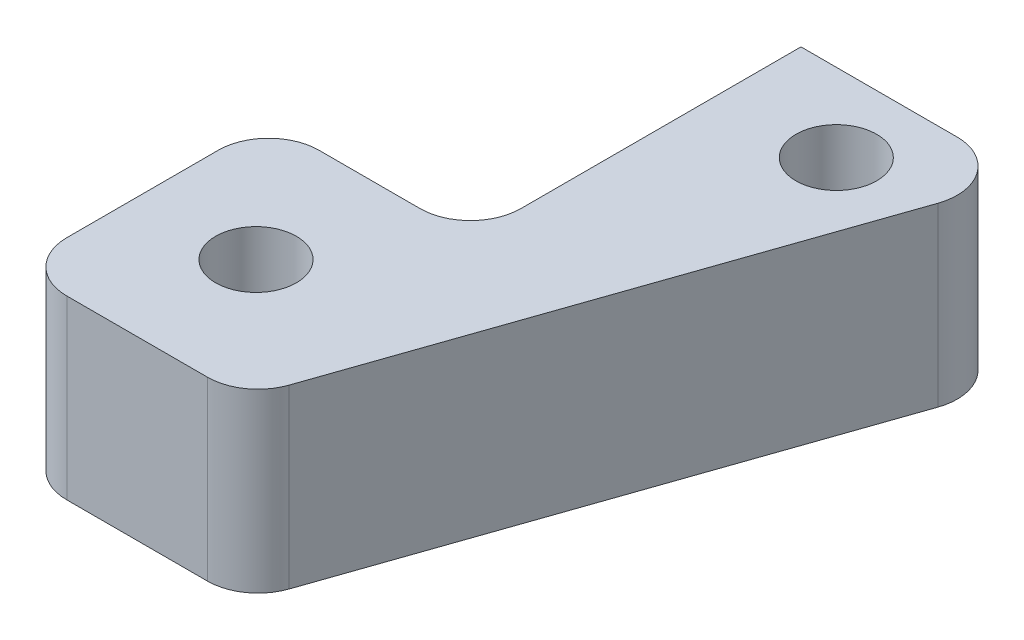
ISO-10303-21;
HEADER;
FILE_DESCRIPTION(('STEP AP214'),'2;1');
FILE_NAME('part.step','',(''),(''),'','','');
FILE_SCHEMA(('AUTOMOTIVE_DESIGN { 1 0 10303 214 1 1 1 1 }'));
ENDSEC;
DATA;
#1=APPLICATION_CONTEXT('core data for automotive mechanical design processes');
#2=APPLICATION_PROTOCOL_DEFINITION('international standard','automotive_design',2000,#1);
#3=PRODUCT_CONTEXT('',#1,'mechanical');
#4=PRODUCT('Part','Part','',(#3));
#5=PRODUCT_RELATED_PRODUCT_CATEGORY('part','',(#4));
#6=PRODUCT_DEFINITION_FORMATION('','',#4);
#7=PRODUCT_DEFINITION_CONTEXT('part definition',#1,'design');
#8=PRODUCT_DEFINITION('design','',#6,#7);
#9=PRODUCT_DEFINITION_SHAPE('','',#8);
#10=(LENGTH_UNIT() NAMED_UNIT(*) SI_UNIT(.MILLI.,.METRE.));
#11=(NAMED_UNIT(*) PLANE_ANGLE_UNIT() SI_UNIT($,.RADIAN.));
#12=(NAMED_UNIT(*) SI_UNIT($,.STERADIAN.) SOLID_ANGLE_UNIT());
#13=UNCERTAINTY_MEASURE_WITH_UNIT(LENGTH_MEASURE(1.E-05),#10,'distance_accuracy_value','');
#14=(GEOMETRIC_REPRESENTATION_CONTEXT(3) GLOBAL_UNCERTAINTY_ASSIGNED_CONTEXT((#13)) GLOBAL_UNIT_ASSIGNED_CONTEXT((#10,
#11,#12)) REPRESENTATION_CONTEXT('',''));
#15=CARTESIAN_POINT('',(0.,0.,0.));
#16=DIRECTION('',(0.,0.,1.));
#17=DIRECTION('',(1.,0.,0.));
#18=AXIS2_PLACEMENT_3D('',#15,#16,#17);
#19=CARTESIAN_POINT('',(0.,-28.7487504583146,25.3802299205823));
#20=DIRECTION('',(0.,0.,-1.));
#21=DIRECTION('',(-1.,0.,0.));
#22=AXIS2_PLACEMENT_3D('',#19,#20,#21);
#23=PLANE('',#22);
#24=DIRECTION('',(1.,0.,0.));
#25=VECTOR('',#24,1.);
#26=CARTESIAN_POINT('',(0.,-28.7487504583146,25.3802299205823));
#27=LINE('',#26,#25);
#28=CARTESIAN_POINT('',(-33.7032833553439,-28.7487504583146,25.3802299205823));
#29=VERTEX_POINT('',#28);
#30=CARTESIAN_POINT('',(-27.5124740465846,-28.7487504583146,25.3802299205823));
#31=VERTEX_POINT('',#30);
#32=EDGE_CURVE('E125',#29,#31,#27,.T.);
#33=ORIENTED_EDGE('',*,*,#32,.T.);
#34=DIRECTION('',(0.,-1.,0.));
#35=VECTOR('',#34,1.);
#36=CARTESIAN_POINT('',(-27.5124740465846,-35.7487504583146,25.3802299205823));
#37=LINE('',#36,#35);
#38=CARTESIAN_POINT('',(-27.5124740465846,-35.7487504583146,25.3802299205823));
#39=VERTEX_POINT('',#38);
#40=EDGE_CURVE('E132',#31,#39,#37,.T.);
#41=ORIENTED_EDGE('',*,*,#40,.T.);
#42=DIRECTION('',(1.,0.,0.));
#43=VECTOR('',#42,1.);
#44=CARTESIAN_POINT('',(0.,-35.7487504583146,25.3802299205823));
#45=LINE('',#44,#43);
#46=CARTESIAN_POINT('',(-33.7032833553439,-35.7487504583146,25.3802299205823));
#47=VERTEX_POINT('',#46);
#48=EDGE_CURVE('E128',#47,#39,#45,.T.);
#49=ORIENTED_EDGE('',*,*,#48,.F.);
#50=DIRECTION('',(0.,-1.,0.));
#51=VECTOR('',#50,1.);
#52=CARTESIAN_POINT('',(-33.7032833553439,-28.7487504583146,25.3802299205823));
#53=LINE('',#52,#51);
#54=EDGE_CURVE('E121',#29,#47,#53,.T.);
#55=ORIENTED_EDGE('',*,*,#54,.F.);
#56=EDGE_LOOP('',(#33,#41,#49,#55));
#57=FACE_BOUND('',#56,.T.);
#58=ADVANCED_FACE('F37',(#57),#23,.T.);
#59=CARTESIAN_POINT('',(-33.7032833553439,-28.7487504583146,0.));
#60=DIRECTION('',(1.,0.,0.));
#61=DIRECTION('',(0.,0.,-1.));
#62=AXIS2_PLACEMENT_3D('',#59,#60,#61);
#63=PLANE('',#62);
#64=DIRECTION('',(0.,0.,1.));
#65=VECTOR('',#64,1.);
#66=CARTESIAN_POINT('',(-33.7032833553439,-35.7487504583146,0.));
#67=LINE('',#66,#65);
#68=CARTESIAN_POINT('',(-33.7032833553439,-35.7487504583146,36.4800354150152));
#69=VERTEX_POINT('',#68);
#70=EDGE_CURVE('E168',#47,#69,#67,.T.);
#71=ORIENTED_EDGE('',*,*,#70,.T.);
#72=DIRECTION('',(0.,-1.,0.));
#73=VECTOR('',#72,1.);
#74=CARTESIAN_POINT('',(-33.7032833553439,-28.7487504583146,36.4800354150152));
#75=LINE('',#74,#73);
#76=CARTESIAN_POINT('',(-33.7032833553439,-28.7487504583146,36.4800354150152));
#77=VERTEX_POINT('',#76);
#78=EDGE_CURVE('E139',#69,#77,#75,.F.);
#79=ORIENTED_EDGE('',*,*,#78,.T.);
#80=DIRECTION('',(0.,0.,1.));
#81=VECTOR('',#80,1.);
#82=CARTESIAN_POINT('',(-33.7032833553439,-28.7487504583146,0.));
#83=LINE('',#82,#81);
#84=EDGE_CURVE('E136',#29,#77,#83,.T.);
#85=ORIENTED_EDGE('',*,*,#84,.F.);
#86=ORIENTED_EDGE('',*,*,#54,.T.);
#87=EDGE_LOOP('',(#71,#79,#85,#86));
#88=FACE_BOUND('',#87,.T.);
#89=ADVANCED_FACE('F137',(#88),#63,.F.);
#90=CARTESIAN_POINT('',(0.,-28.7487504583146,38.4800354150152));
#91=DIRECTION('',(0.,0.,-1.));
#92=DIRECTION('',(-1.,0.,0.));
#93=AXIS2_PLACEMENT_3D('',#90,#91,#92);
#94=PLANE('',#93);
#95=DIRECTION('',(1.,0.,0.));
#96=VECTOR('',#95,1.);
#97=CARTESIAN_POINT('',(0.,-35.7487504583146,38.4800354150152));
#98=LINE('',#97,#96);
#99=CARTESIAN_POINT('',(-39.7032833553439,-35.7487504583146,38.4800354150152));
#100=VERTEX_POINT('',#99);
#101=CARTESIAN_POINT('',(-35.7032833553439,-35.7487504583146,38.4800354150152));
#102=VERTEX_POINT('',#101);
#103=EDGE_CURVE('E170',#100,#102,#98,.T.);
#104=ORIENTED_EDGE('',*,*,#103,.F.);
#105=DIRECTION('',(0.,-1.,0.));
#106=VECTOR('',#105,1.);
#107=CARTESIAN_POINT('',(-39.7032833553439,-28.7487504583146,38.4800354150152));
#108=LINE('',#107,#106);
#109=CARTESIAN_POINT('',(-39.7032833553439,-28.7487504583146,38.4800354150152));
#110=VERTEX_POINT('',#109);
#111=EDGE_CURVE('E217',#100,#110,#108,.F.);
#112=ORIENTED_EDGE('',*,*,#111,.T.);
#113=DIRECTION('',(1.,0.,0.));
#114=VECTOR('',#113,1.);
#115=CARTESIAN_POINT('',(0.,-28.7487504583146,38.4800354150152));
#116=LINE('',#115,#114);
#117=CARTESIAN_POINT('',(-35.7032833553439,-28.7487504583146,38.4800354150152));
#118=VERTEX_POINT('',#117);
#119=EDGE_CURVE('E141',#110,#118,#116,.T.);
#120=ORIENTED_EDGE('',*,*,#119,.T.);
#121=DIRECTION('',(0.,-1.,0.));
#122=VECTOR('',#121,1.);
#123=CARTESIAN_POINT('',(-35.7032833553439,-28.7487504583146,38.4800354150152));
#124=LINE('',#123,#122);
#125=EDGE_CURVE('E214',#118,#102,#124,.T.);
#126=ORIENTED_EDGE('',*,*,#125,.T.);
#127=EDGE_LOOP('',(#104,#112,#120,#126));
#128=FACE_BOUND('',#127,.T.);
#129=ADVANCED_FACE('F227',(#128),#94,.T.);
#130=CARTESIAN_POINT('',(-41.7032833553439,-28.7487504583146,0.));
#131=DIRECTION('',(-1.,0.,0.));
#132=DIRECTION('',(0.,0.,1.));
#133=AXIS2_PLACEMENT_3D('',#130,#131,#132);
#134=PLANE('',#133);
#135=DIRECTION('',(0.,0.,-1.));
#136=VECTOR('',#135,1.);
#137=CARTESIAN_POINT('',(-41.7032833553439,-35.7487504583146,0.));
#138=LINE('',#137,#136);
#139=CARTESIAN_POINT('',(-41.7032833553439,-35.7487504583146,46.4800354150152));
#140=VERTEX_POINT('',#139);
#141=CARTESIAN_POINT('',(-41.7032833553439,-35.7487504583146,40.4800354150152));
#142=VERTEX_POINT('',#141);
#143=EDGE_CURVE('E173',#140,#142,#138,.T.);
#144=ORIENTED_EDGE('',*,*,#143,.F.);
#145=DIRECTION('',(0.,-1.,0.));
#146=VECTOR('',#145,1.);
#147=CARTESIAN_POINT('',(-41.7032833553439,-28.7487504583146,46.4800354150152));
#148=LINE('',#147,#146);
#149=CARTESIAN_POINT('',(-41.7032833553439,-28.7487504583146,46.4800354150152));
#150=VERTEX_POINT('',#149);
#151=EDGE_CURVE('E59',#140,#150,#148,.F.);
#152=ORIENTED_EDGE('',*,*,#151,.T.);
#153=DIRECTION('',(0.,0.,-1.));
#154=VECTOR('',#153,1.);
#155=CARTESIAN_POINT('',(-41.7032833553439,-28.7487504583146,0.));
#156=LINE('',#155,#154);
#157=CARTESIAN_POINT('',(-41.7032833553439,-28.7487504583146,40.4800354150152));
#158=VERTEX_POINT('',#157);
#159=EDGE_CURVE('E156',#150,#158,#156,.T.);
#160=ORIENTED_EDGE('',*,*,#159,.T.);
#161=DIRECTION('',(0.,-1.,0.));
#162=VECTOR('',#161,1.);
#163=CARTESIAN_POINT('',(-41.7032833553439,-28.7487504583146,40.4800354150152));
#164=LINE('',#163,#162);
#165=EDGE_CURVE('E210',#158,#142,#164,.T.);
#166=ORIENTED_EDGE('',*,*,#165,.T.);
#167=EDGE_LOOP('',(#144,#152,#160,#166));
#168=FACE_BOUND('',#167,.T.);
#169=ADVANCED_FACE('F232',(#168),#134,.T.);
#170=CARTESIAN_POINT('',(0.,-28.7487504583146,48.4800354150152));
#171=DIRECTION('',(0.,0.,-1.));
#172=DIRECTION('',(-1.,0.,0.));
#173=AXIS2_PLACEMENT_3D('',#170,#171,#172);
#174=PLANE('',#173);
#175=DIRECTION('',(1.,0.,0.));
#176=VECTOR('',#175,1.);
#177=CARTESIAN_POINT('',(0.,-35.7487504583146,48.4800354150152));
#178=LINE('',#177,#176);
#179=CARTESIAN_POINT('',(-39.7032833553439,-35.7487504583146,48.4800354150152));
#180=VERTEX_POINT('',#179);
#181=CARTESIAN_POINT('',(-34.1271809969218,-35.7487504583146,48.4800354150152));
#182=VERTEX_POINT('',#181);
#183=EDGE_CURVE('E176',#180,#182,#178,.T.);
#184=ORIENTED_EDGE('',*,*,#183,.T.);
#185=DIRECTION('',(0.,-1.,0.));
#186=VECTOR('',#185,1.);
#187=CARTESIAN_POINT('',(-34.1271809969218,-28.7487504583146,48.4800354150152));
#188=LINE('',#187,#186);
#189=CARTESIAN_POINT('',(-34.1271809969218,-28.7487504583146,48.4800354150152));
#190=VERTEX_POINT('',#189);
#191=EDGE_CURVE('E203',#182,#190,#188,.F.);
#192=ORIENTED_EDGE('',*,*,#191,.T.);
#193=DIRECTION('',(1.,0.,0.));
#194=VECTOR('',#193,1.);
#195=CARTESIAN_POINT('',(0.,-28.7487504583146,48.4800354150152));
#196=LINE('',#195,#194);
#197=CARTESIAN_POINT('',(-39.7032833553439,-28.7487504583146,48.4800354150152));
#198=VERTEX_POINT('',#197);
#199=EDGE_CURVE('E158',#198,#190,#196,.T.);
#200=ORIENTED_EDGE('',*,*,#199,.F.);
#201=DIRECTION('',(0.,-1.,0.));
#202=VECTOR('',#201,1.);
#203=CARTESIAN_POINT('',(-39.7032833553439,-35.7487504583146,48.4800354150152));
#204=LINE('',#203,#202);
#205=EDGE_CURVE('E200',#198,#180,#204,.T.);
#206=ORIENTED_EDGE('',*,*,#205,.T.);
#207=EDGE_LOOP('',(#184,#192,#200,#206));
#208=FACE_BOUND('',#207,.T.);
#209=ADVANCED_FACE('F240',(#208),#174,.F.);
#210=CARTESIAN_POINT('',(-37.2032833553439,-28.7487504583146,43.4800354150152));
#211=DIRECTION('',(0.,-1.,0.));
#212=DIRECTION('',(0.,0.,-1.));
#213=AXIS2_PLACEMENT_3D('',#210,#211,#212);
#214=CYLINDRICAL_SURFACE('',#213,1.6);
#215=CARTESIAN_POINT('',(-37.2032833553439,-28.7487504583146,43.4800354150152));
#216=DIRECTION('',(0.,1.,0.));
#217=DIRECTION('',(0.,0.,1.));
#218=AXIS2_PLACEMENT_3D('',#215,#216,#217);
#219=CIRCLE('',#218,1.6);
#220=CARTESIAN_POINT('',(-37.2032833553439,-28.7487504583146,45.0800354150152));
#221=VERTEX_POINT('',#220);
#222=EDGE_CURVE('E162',#221,#221,#219,.T.);
#223=ORIENTED_EDGE('',*,*,#222,.T.);
#224=EDGE_LOOP('',(#223));
#225=FACE_BOUND('',#224,.T.);
#226=CARTESIAN_POINT('',(-37.2032833553439,-35.7487504583146,43.4800354150152));
#227=DIRECTION('',(0.,1.,0.));
#228=DIRECTION('',(0.,0.,1.));
#229=AXIS2_PLACEMENT_3D('',#226,#227,#228);
#230=CIRCLE('',#229,1.6);
#231=CARTESIAN_POINT('',(-37.2032833553439,-35.7487504583146,45.0800354150152));
#232=VERTEX_POINT('',#231);
#233=EDGE_CURVE('E151',#232,#232,#230,.T.);
#234=ORIENTED_EDGE('',*,*,#233,.F.);
#235=EDGE_LOOP('',(#234));
#236=FACE_BOUND('',#235,.T.);
#237=ADVANCED_FACE('F273',(#225,#236),#214,.F.);
#238=CARTESIAN_POINT('',(-14.20926312172,-28.7487504583146,-4.92099836083711));
#239=DIRECTION('',(-0.944936577153047,0.,-0.327253518175564));
#240=DIRECTION('',(-0.327253518175564,0.,0.944936577153047));
#241=AXIS2_PLACEMENT_3D('',#238,#239,#240);
#242=PLANE('',#241);
#243=DIRECTION('',(0.327253518175564,0.,-0.944936577153047));
#244=VECTOR('',#243,1.);
#245=CARTESIAN_POINT('',(-14.20926312172,-28.7487504583146,-4.92099836083711));
#246=LINE('',#245,#244);
#247=CARTESIAN_POINT('',(-32.2373078426157,-28.7487504583146,47.1345424513663));
#248=VERTEX_POINT('',#247);
#249=CARTESIAN_POINT('',(-25.6226008922785,-28.7487504583146,28.0347369569334));
#250=VERTEX_POINT('',#249);
#251=EDGE_CURVE('E160',#248,#250,#246,.T.);
#252=ORIENTED_EDGE('',*,*,#251,.F.);
#253=DIRECTION('',(0.,-1.,0.));
#254=VECTOR('',#253,1.);
#255=CARTESIAN_POINT('',(-32.2373078426157,-28.7487504583146,47.1345424513663));
#256=LINE('',#255,#254);
#257=CARTESIAN_POINT('',(-32.2373078426157,-35.7487504583146,47.1345424513663));
#258=VERTEX_POINT('',#257);
#259=EDGE_CURVE('E191',#248,#258,#256,.T.);
#260=ORIENTED_EDGE('',*,*,#259,.T.);
#261=DIRECTION('',(0.327253518175564,0.,-0.944936577153047));
#262=VECTOR('',#261,1.);
#263=CARTESIAN_POINT('',(-14.20926312172,-35.7487504583146,-4.92099836083711));
#264=LINE('',#263,#262);
#265=CARTESIAN_POINT('',(-25.6226008922785,-35.7487504583146,28.0347369569334));
#266=VERTEX_POINT('',#265);
#267=EDGE_CURVE('E179',#258,#266,#264,.T.);
#268=ORIENTED_EDGE('',*,*,#267,.T.);
#269=DIRECTION('',(0.,-1.,0.));
#270=VECTOR('',#269,1.);
#271=CARTESIAN_POINT('',(-25.6226008922785,-28.7487504583146,28.0347369569334));
#272=LINE('',#271,#270);
#273=EDGE_CURVE('E187',#266,#250,#272,.F.);
#274=ORIENTED_EDGE('',*,*,#273,.T.);
#275=EDGE_LOOP('',(#252,#260,#268,#274));
#276=FACE_BOUND('',#275,.T.);
#277=ADVANCED_FACE('F248',(#276),#242,.F.);
#278=CARTESIAN_POINT('',(-29.2032833553439,-28.7487504583146,28.4800354150152));
#279=DIRECTION('',(0.,-1.,0.));
#280=DIRECTION('',(0.,0.,-1.));
#281=AXIS2_PLACEMENT_3D('',#278,#279,#280);
#282=CYLINDRICAL_SURFACE('',#281,1.6);
#283=CARTESIAN_POINT('',(-29.2032833553439,-28.7487504583146,28.4800354150152));
#284=DIRECTION('',(0.,1.,0.));
#285=DIRECTION('',(0.,0.,1.));
#286=AXIS2_PLACEMENT_3D('',#283,#284,#285);
#287=CIRCLE('',#286,1.6);
#288=CARTESIAN_POINT('',(-29.2032833553439,-28.7487504583146,30.0800354150152));
#289=VERTEX_POINT('',#288);
#290=EDGE_CURVE('E133',#289,#289,#287,.F.);
#291=ORIENTED_EDGE('',*,*,#290,.F.);
#292=EDGE_LOOP('',(#291));
#293=FACE_BOUND('',#292,.T.);
#294=CARTESIAN_POINT('',(-29.2032833553439,-35.7487504583146,28.4800354150152));
#295=DIRECTION('',(0.,1.,0.));
#296=DIRECTION('',(0.,0.,1.));
#297=AXIS2_PLACEMENT_3D('',#294,#295,#296);
#298=CIRCLE('',#297,1.6);
#299=CARTESIAN_POINT('',(-29.2032833553439,-35.7487504583146,30.0800354150152));
#300=VERTEX_POINT('',#299);
#301=EDGE_CURVE('E148',#300,#300,#298,.F.);
#302=ORIENTED_EDGE('',*,*,#301,.T.);
#303=EDGE_LOOP('',(#302));
#304=FACE_BOUND('',#303,.T.);
#305=ADVANCED_FACE('F276',(#293,#304),#282,.F.);
#306=CARTESIAN_POINT('',(0.,-28.7487504583146,0.));
#307=DIRECTION('',(0.,1.,0.));
#308=DIRECTION('',(0.,0.,1.));
#309=AXIS2_PLACEMENT_3D('',#306,#307,#308);
#310=PLANE('',#309);
#311=ORIENTED_EDGE('',*,*,#199,.T.);
#312=CARTESIAN_POINT('',(-34.1271809969218,-28.7487504583146,46.4800354150152));
#313=DIRECTION('',(0.,1.,0.));
#314=DIRECTION('',(0.,0.,1.));
#315=AXIS2_PLACEMENT_3D('',#312,#313,#314);
#316=CIRCLE('',#315,2.);
#317=EDGE_CURVE('E208',#190,#248,#316,.T.);
#318=ORIENTED_EDGE('',*,*,#317,.T.);
#319=ORIENTED_EDGE('',*,*,#251,.T.);
#320=CARTESIAN_POINT('',(-27.5124740465846,-28.7487504583146,27.3802299205823));
#321=DIRECTION('',(0.,1.,0.));
#322=DIRECTION('',(0.,0.,1.));
#323=AXIS2_PLACEMENT_3D('',#320,#321,#322);
#324=CIRCLE('',#323,2.);
#325=EDGE_CURVE('E147',#250,#31,#324,.T.);
#326=ORIENTED_EDGE('',*,*,#325,.T.);
#327=ORIENTED_EDGE('',*,*,#32,.F.);
#328=ORIENTED_EDGE('',*,*,#84,.T.);
#329=CARTESIAN_POINT('',(-35.7032833553439,-28.7487504583146,36.4800354150152));
#330=DIRECTION('',(0.,1.,0.));
#331=DIRECTION('',(0.,0.,1.));
#332=AXIS2_PLACEMENT_3D('',#329,#330,#331);
#333=CIRCLE('',#332,2.);
#334=EDGE_CURVE('E11',#77,#118,#333,.F.);
#335=ORIENTED_EDGE('',*,*,#334,.T.);
#336=ORIENTED_EDGE('',*,*,#119,.F.);
#337=CARTESIAN_POINT('',(-39.7032833553439,-28.7487504583146,40.4800354150152));
#338=DIRECTION('',(0.,1.,0.));
#339=DIRECTION('',(0.,0.,1.));
#340=AXIS2_PLACEMENT_3D('',#337,#338,#339);
#341=CIRCLE('',#340,2.);
#342=EDGE_CURVE('E52',#110,#158,#341,.T.);
#343=ORIENTED_EDGE('',*,*,#342,.T.);
#344=ORIENTED_EDGE('',*,*,#159,.F.);
#345=CARTESIAN_POINT('',(-39.7032833553439,-28.7487504583146,46.4800354150152));
#346=DIRECTION('',(0.,1.,0.));
#347=DIRECTION('',(0.,0.,1.));
#348=AXIS2_PLACEMENT_3D('',#345,#346,#347);
#349=CIRCLE('',#348,2.);
#350=EDGE_CURVE('E206',#150,#198,#349,.T.);
#351=ORIENTED_EDGE('',*,*,#350,.T.);
#352=EDGE_LOOP('',(#311,#318,#319,#326,#327,#328,#335,#336,#343,#344,#351));
#353=FACE_BOUND('',#352,.T.);
#354=ORIENTED_EDGE('',*,*,#222,.F.);
#355=EDGE_LOOP('',(#354));
#356=FACE_BOUND('',#355,.T.);
#357=ORIENTED_EDGE('',*,*,#290,.T.);
#358=EDGE_LOOP('',(#357));
#359=FACE_BOUND('',#358,.T.);
#360=ADVANCED_FACE('F144',(#353,#356,#359),#310,.T.);
#361=CARTESIAN_POINT('',(0.,-35.7487504583146,0.));
#362=DIRECTION('',(0.,1.,0.));
#363=DIRECTION('',(0.,0.,1.));
#364=AXIS2_PLACEMENT_3D('',#361,#362,#363);
#365=PLANE('',#364);
#366=ORIENTED_EDGE('',*,*,#267,.F.);
#367=CARTESIAN_POINT('',(-34.1271809969218,-35.7487504583146,46.4800354150152));
#368=DIRECTION('',(0.,1.,0.));
#369=DIRECTION('',(0.,0.,1.));
#370=AXIS2_PLACEMENT_3D('',#367,#368,#369);
#371=CIRCLE('',#370,2.);
#372=EDGE_CURVE('E198',#258,#182,#371,.F.);
#373=ORIENTED_EDGE('',*,*,#372,.T.);
#374=ORIENTED_EDGE('',*,*,#183,.F.);
#375=CARTESIAN_POINT('',(-39.7032833553439,-35.7487504583146,46.4800354150152));
#376=DIRECTION('',(0.,1.,0.));
#377=DIRECTION('',(0.,0.,1.));
#378=AXIS2_PLACEMENT_3D('',#375,#376,#377);
#379=CIRCLE('',#378,2.);
#380=EDGE_CURVE('E196',#180,#140,#379,.F.);
#381=ORIENTED_EDGE('',*,*,#380,.T.);
#382=ORIENTED_EDGE('',*,*,#143,.T.);
#383=CARTESIAN_POINT('',(-39.7032833553439,-35.7487504583146,40.4800354150152));
#384=DIRECTION('',(0.,1.,0.));
#385=DIRECTION('',(0.,0.,1.));
#386=AXIS2_PLACEMENT_3D('',#383,#384,#385);
#387=CIRCLE('',#386,2.);
#388=EDGE_CURVE('E194',#142,#100,#387,.F.);
#389=ORIENTED_EDGE('',*,*,#388,.T.);
#390=ORIENTED_EDGE('',*,*,#103,.T.);
#391=CARTESIAN_POINT('',(-35.7032833553439,-35.7487504583146,36.4800354150152));
#392=DIRECTION('',(0.,1.,0.));
#393=DIRECTION('',(0.,0.,1.));
#394=AXIS2_PLACEMENT_3D('',#391,#392,#393);
#395=CIRCLE('',#394,2.);
#396=EDGE_CURVE('E45',#102,#69,#395,.T.);
#397=ORIENTED_EDGE('',*,*,#396,.T.);
#398=ORIENTED_EDGE('',*,*,#70,.F.);
#399=ORIENTED_EDGE('',*,*,#48,.T.);
#400=CARTESIAN_POINT('',(-27.5124740465846,-35.7487504583146,27.3802299205823));
#401=DIRECTION('',(0.,1.,0.));
#402=DIRECTION('',(0.,0.,1.));
#403=AXIS2_PLACEMENT_3D('',#400,#401,#402);
#404=CIRCLE('',#403,2.);
#405=EDGE_CURVE('E184',#39,#266,#404,.F.);
#406=ORIENTED_EDGE('',*,*,#405,.T.);
#407=EDGE_LOOP('',(#366,#373,#374,#381,#382,#389,#390,#397,#398,#399,#406));
#408=FACE_BOUND('',#407,.T.);
#409=ORIENTED_EDGE('',*,*,#233,.T.);
#410=EDGE_LOOP('',(#409));
#411=FACE_BOUND('',#410,.T.);
#412=ORIENTED_EDGE('',*,*,#301,.F.);
#413=EDGE_LOOP('',(#412));
#414=FACE_BOUND('',#413,.T.);
#415=ADVANCED_FACE('F221',(#408,#411,#414),#365,.F.);
#416=CARTESIAN_POINT('',(-27.5124740465846,-28.7487504583146,27.3802299205823));
#417=DIRECTION('',(0.,1.,0.));
#418=DIRECTION('',(0.,0.,1.));
#419=AXIS2_PLACEMENT_3D('',#416,#417,#418);
#420=CYLINDRICAL_SURFACE('',#419,2.);
#421=ORIENTED_EDGE('',*,*,#325,.F.);
#422=ORIENTED_EDGE('',*,*,#273,.F.);
#423=ORIENTED_EDGE('',*,*,#405,.F.);
#424=ORIENTED_EDGE('',*,*,#40,.F.);
#425=EDGE_LOOP('',(#421,#422,#423,#424));
#426=FACE_BOUND('',#425,.T.);
#427=ADVANCED_FACE('F251',(#426),#420,.T.);
#428=CARTESIAN_POINT('',(-34.1271809969218,-28.7487504583146,46.4800354150152));
#429=DIRECTION('',(0.,-1.,0.));
#430=DIRECTION('',(0.,0.,-1.));
#431=AXIS2_PLACEMENT_3D('',#428,#429,#430);
#432=CYLINDRICAL_SURFACE('',#431,2.);
#433=ORIENTED_EDGE('',*,*,#317,.F.);
#434=ORIENTED_EDGE('',*,*,#191,.F.);
#435=ORIENTED_EDGE('',*,*,#372,.F.);
#436=ORIENTED_EDGE('',*,*,#259,.F.);
#437=EDGE_LOOP('',(#433,#434,#435,#436));
#438=FACE_BOUND('',#437,.T.);
#439=ADVANCED_FACE('F246',(#438),#432,.T.);
#440=CARTESIAN_POINT('',(-39.7032833553439,-28.7487504583146,46.4800354150152));
#441=DIRECTION('',(0.,1.,0.));
#442=DIRECTION('',(0.,0.,1.));
#443=AXIS2_PLACEMENT_3D('',#440,#441,#442);
#444=CYLINDRICAL_SURFACE('',#443,2.);
#445=ORIENTED_EDGE('',*,*,#350,.F.);
#446=ORIENTED_EDGE('',*,*,#151,.F.);
#447=ORIENTED_EDGE('',*,*,#380,.F.);
#448=ORIENTED_EDGE('',*,*,#205,.F.);
#449=EDGE_LOOP('',(#445,#446,#447,#448));
#450=FACE_BOUND('',#449,.T.);
#451=ADVANCED_FACE('F237',(#450),#444,.T.);
#452=CARTESIAN_POINT('',(-39.7032833553439,-28.7487504583146,40.4800354150152));
#453=DIRECTION('',(0.,-1.,0.));
#454=DIRECTION('',(0.,0.,-1.));
#455=AXIS2_PLACEMENT_3D('',#452,#453,#454);
#456=CYLINDRICAL_SURFACE('',#455,2.);
#457=ORIENTED_EDGE('',*,*,#342,.F.);
#458=ORIENTED_EDGE('',*,*,#111,.F.);
#459=ORIENTED_EDGE('',*,*,#388,.F.);
#460=ORIENTED_EDGE('',*,*,#165,.F.);
#461=EDGE_LOOP('',(#457,#458,#459,#460));
#462=FACE_BOUND('',#461,.T.);
#463=ADVANCED_FACE('F230',(#462),#456,.T.);
#464=CARTESIAN_POINT('',(-35.7032833553439,-28.7487504583146,36.4800354150152));
#465=DIRECTION('',(0.,-1.,0.));
#466=DIRECTION('',(0.,0.,-1.));
#467=AXIS2_PLACEMENT_3D('',#464,#465,#466);
#468=CYLINDRICAL_SURFACE('',#467,2.);
#469=ORIENTED_EDGE('',*,*,#334,.F.);
#470=ORIENTED_EDGE('',*,*,#78,.F.);
#471=ORIENTED_EDGE('',*,*,#396,.F.);
#472=ORIENTED_EDGE('',*,*,#125,.F.);
#473=EDGE_LOOP('',(#469,#470,#471,#472));
#474=FACE_BOUND('',#473,.T.);
#475=ADVANCED_FACE('F39',(#474),#468,.F.);
#476=CLOSED_SHELL('',(#58,#89,#129,#169,#209,#237,#277,#305,#360,#415,#427,#439,#451,#463,#475));
#477=MANIFOLD_SOLID_BREP('B2',#476);
#478=ADVANCED_BREP_SHAPE_REPRESENTATION('',(#18,#477),#14);
#479=SHAPE_DEFINITION_REPRESENTATION(#9,#478);
ENDSEC;
END-ISO-10303-21;
